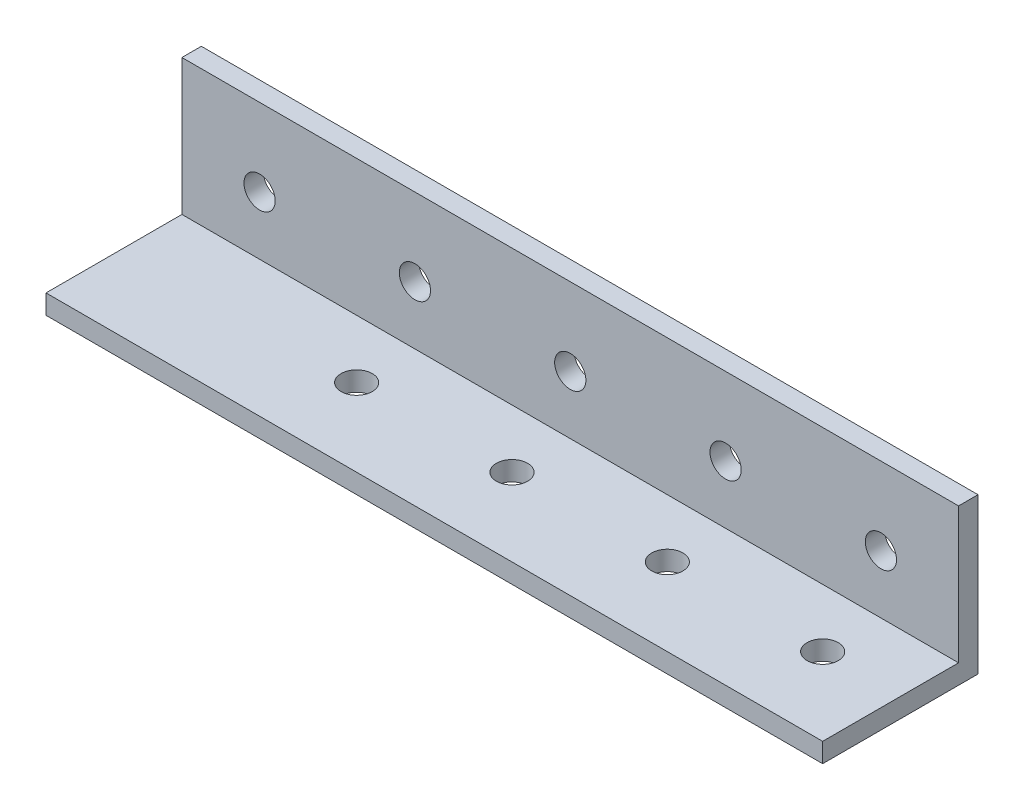
ISO-10303-21;
HEADER;
FILE_DESCRIPTION(('STEP AP214'),'2;1');
FILE_NAME('part.step','',(''),(''),'','','');
FILE_SCHEMA(('AUTOMOTIVE_DESIGN { 1 0 10303 214 1 1 1 1 }'));
ENDSEC;
DATA;
#1=APPLICATION_CONTEXT('core data for automotive mechanical design processes');
#2=APPLICATION_PROTOCOL_DEFINITION('international standard','automotive_design',2000,#1);
#3=PRODUCT_CONTEXT('',#1,'mechanical');
#4=PRODUCT('Part','Part','',(#3));
#5=PRODUCT_RELATED_PRODUCT_CATEGORY('part','',(#4));
#6=PRODUCT_DEFINITION_FORMATION('','',#4);
#7=PRODUCT_DEFINITION_CONTEXT('part definition',#1,'design');
#8=PRODUCT_DEFINITION('design','',#6,#7);
#9=PRODUCT_DEFINITION_SHAPE('','',#8);
#10=(LENGTH_UNIT() NAMED_UNIT(*) SI_UNIT(.MILLI.,.METRE.));
#11=(NAMED_UNIT(*) PLANE_ANGLE_UNIT() SI_UNIT($,.RADIAN.));
#12=(NAMED_UNIT(*) SI_UNIT($,.STERADIAN.) SOLID_ANGLE_UNIT());
#13=UNCERTAINTY_MEASURE_WITH_UNIT(LENGTH_MEASURE(1.E-05),#10,'distance_accuracy_value','');
#14=(GEOMETRIC_REPRESENTATION_CONTEXT(3) GLOBAL_UNCERTAINTY_ASSIGNED_CONTEXT((#13)) GLOBAL_UNIT_ASSIGNED_CONTEXT((#10,
#11,#12)) REPRESENTATION_CONTEXT('',''));
#15=CARTESIAN_POINT('',(0.,0.,0.));
#16=DIRECTION('',(0.,0.,1.));
#17=DIRECTION('',(1.,0.,0.));
#18=AXIS2_PLACEMENT_3D('',#15,#16,#17);
#19=CARTESIAN_POINT('',(127.,0.,0.));
#20=DIRECTION('',(0.,0.,-1.));
#21=DIRECTION('',(-1.,0.,0.));
#22=AXIS2_PLACEMENT_3D('',#19,#20,#21);
#23=PLANE('',#22);
#24=CARTESIAN_POINT('',(12.7,12.7,0.));
#25=DIRECTION('',(0.,0.,1.));
#26=DIRECTION('',(1.,0.,0.));
#27=AXIS2_PLACEMENT_3D('',#24,#25,#26);
#28=CIRCLE('',#27,2.55269999999999);
#29=CARTESIAN_POINT('',(15.2527,12.7,0.));
#30=VERTEX_POINT('',#29);
#31=EDGE_CURVE('E197',#30,#30,#28,.T.);
#32=ORIENTED_EDGE('',*,*,#31,.T.);
#33=EDGE_LOOP('',(#32));
#34=FACE_BOUND('',#33,.T.);
#35=CARTESIAN_POINT('',(38.1,12.7,0.));
#36=DIRECTION('',(0.,0.,1.));
#37=DIRECTION('',(1.,0.,0.));
#38=AXIS2_PLACEMENT_3D('',#35,#36,#37);
#39=CIRCLE('',#38,2.55269999999998);
#40=CARTESIAN_POINT('',(40.6527,12.7,0.));
#41=VERTEX_POINT('',#40);
#42=EDGE_CURVE('E201',#41,#41,#39,.T.);
#43=ORIENTED_EDGE('',*,*,#42,.T.);
#44=EDGE_LOOP('',(#43));
#45=FACE_BOUND('',#44,.T.);
#46=CARTESIAN_POINT('',(63.5,12.7,0.));
#47=DIRECTION('',(0.,0.,1.));
#48=DIRECTION('',(1.,0.,0.));
#49=AXIS2_PLACEMENT_3D('',#46,#47,#48);
#50=CIRCLE('',#49,2.55269999999999);
#51=CARTESIAN_POINT('',(66.0527,12.7,0.));
#52=VERTEX_POINT('',#51);
#53=EDGE_CURVE('E205',#52,#52,#50,.T.);
#54=ORIENTED_EDGE('',*,*,#53,.T.);
#55=EDGE_LOOP('',(#54));
#56=FACE_BOUND('',#55,.T.);
#57=CARTESIAN_POINT('',(88.9,12.7,0.));
#58=DIRECTION('',(0.,0.,1.));
#59=DIRECTION('',(1.,0.,0.));
#60=AXIS2_PLACEMENT_3D('',#57,#58,#59);
#61=CIRCLE('',#60,2.55269999999999);
#62=CARTESIAN_POINT('',(91.4527,12.7,0.));
#63=VERTEX_POINT('',#62);
#64=EDGE_CURVE('E209',#63,#63,#61,.T.);
#65=ORIENTED_EDGE('',*,*,#64,.T.);
#66=EDGE_LOOP('',(#65));
#67=FACE_BOUND('',#66,.T.);
#68=CARTESIAN_POINT('',(114.3,12.7,0.));
#69=DIRECTION('',(0.,0.,1.));
#70=DIRECTION('',(1.,0.,0.));
#71=AXIS2_PLACEMENT_3D('',#68,#69,#70);
#72=CIRCLE('',#71,2.55269999999999);
#73=CARTESIAN_POINT('',(116.8527,12.7,0.));
#74=VERTEX_POINT('',#73);
#75=EDGE_CURVE('E212',#74,#74,#72,.T.);
#76=ORIENTED_EDGE('',*,*,#75,.T.);
#77=EDGE_LOOP('',(#76));
#78=FACE_BOUND('',#77,.T.);
#79=DIRECTION('',(-1.,0.,0.));
#80=VECTOR('',#79,1.);
#81=CARTESIAN_POINT('',(127.,25.4,0.));
#82=LINE('',#81,#80);
#83=CARTESIAN_POINT('',(127.,25.4,0.));
#84=VERTEX_POINT('',#83);
#85=CARTESIAN_POINT('',(0.,25.4,0.));
#86=VERTEX_POINT('',#85);
#87=EDGE_CURVE('E141',#84,#86,#82,.T.);
#88=ORIENTED_EDGE('',*,*,#87,.F.);
#89=DIRECTION('',(0.,1.,0.));
#90=VECTOR('',#89,1.);
#91=CARTESIAN_POINT('',(127.,0.,0.));
#92=LINE('',#91,#90);
#93=CARTESIAN_POINT('',(127.,0.,0.));
#94=VERTEX_POINT('',#93);
#95=EDGE_CURVE('E11',#94,#84,#92,.T.);
#96=ORIENTED_EDGE('',*,*,#95,.F.);
#97=DIRECTION('',(-1.,0.,0.));
#98=VECTOR('',#97,1.);
#99=CARTESIAN_POINT('',(127.,0.,0.));
#100=LINE('',#99,#98);
#101=CARTESIAN_POINT('',(0.,0.,0.));
#102=VERTEX_POINT('',#101);
#103=EDGE_CURVE('E144',#94,#102,#100,.T.);
#104=ORIENTED_EDGE('',*,*,#103,.T.);
#105=DIRECTION('',(0.,1.,0.));
#106=VECTOR('',#105,1.);
#107=CARTESIAN_POINT('',(0.,0.,0.));
#108=LINE('',#107,#106);
#109=EDGE_CURVE('E91',#102,#86,#108,.T.);
#110=ORIENTED_EDGE('',*,*,#109,.T.);
#111=EDGE_LOOP('',(#88,#96,#104,#110));
#112=FACE_BOUND('',#111,.T.);
#113=ADVANCED_FACE('F45',(#34,#45,#56,#67,#78,#112),#23,.T.);
#114=CARTESIAN_POINT('',(127.,0.,25.4));
#115=DIRECTION('',(1.,0.,0.));
#116=DIRECTION('',(0.,0.,-1.));
#117=AXIS2_PLACEMENT_3D('',#114,#115,#116);
#118=PLANE('',#117);
#119=DIRECTION('',(0.,0.,-1.));
#120=VECTOR('',#119,1.);
#121=CARTESIAN_POINT('',(127.,3.175,25.4));
#122=LINE('',#121,#120);
#123=CARTESIAN_POINT('',(127.,3.175,25.4));
#124=VERTEX_POINT('',#123);
#125=CARTESIAN_POINT('',(127.,3.175,3.175));
#126=VERTEX_POINT('',#125);
#127=EDGE_CURVE('E115',#124,#126,#122,.T.);
#128=ORIENTED_EDGE('',*,*,#127,.F.);
#129=DIRECTION('',(0.,1.,0.));
#130=VECTOR('',#129,1.);
#131=CARTESIAN_POINT('',(127.,0.,25.4));
#132=LINE('',#131,#130);
#133=CARTESIAN_POINT('',(127.,0.,25.4));
#134=VERTEX_POINT('',#133);
#135=EDGE_CURVE('E54',#134,#124,#132,.T.);
#136=ORIENTED_EDGE('',*,*,#135,.F.);
#137=DIRECTION('',(0.,0.,-1.));
#138=VECTOR('',#137,1.);
#139=CARTESIAN_POINT('',(127.,0.,25.4));
#140=LINE('',#139,#138);
#141=EDGE_CURVE('E154',#134,#94,#140,.T.);
#142=ORIENTED_EDGE('',*,*,#141,.T.);
#143=ORIENTED_EDGE('',*,*,#95,.T.);
#144=DIRECTION('',(0.,0.,-1.));
#145=VECTOR('',#144,1.);
#146=CARTESIAN_POINT('',(127.,25.4,25.4));
#147=LINE('',#146,#145);
#148=CARTESIAN_POINT('',(127.,25.4,3.175));
#149=VERTEX_POINT('',#148);
#150=EDGE_CURVE('E85',#149,#84,#147,.T.);
#151=ORIENTED_EDGE('',*,*,#150,.F.);
#152=DIRECTION('',(0.,1.,0.));
#153=VECTOR('',#152,1.);
#154=CARTESIAN_POINT('',(127.,3.175,3.175));
#155=LINE('',#154,#153);
#156=EDGE_CURVE('E62',#126,#149,#155,.T.);
#157=ORIENTED_EDGE('',*,*,#156,.F.);
#158=EDGE_LOOP('',(#128,#136,#142,#143,#151,#157));
#159=FACE_BOUND('',#158,.T.);
#160=ADVANCED_FACE('F185',(#159),#118,.T.);
#161=CARTESIAN_POINT('',(0.,0.,25.4));
#162=DIRECTION('',(0.,0.,1.));
#163=DIRECTION('',(1.,0.,0.));
#164=AXIS2_PLACEMENT_3D('',#161,#162,#163);
#165=PLANE('',#164);
#166=DIRECTION('',(1.,0.,0.));
#167=VECTOR('',#166,1.);
#168=CARTESIAN_POINT('',(0.,3.175,25.4));
#169=LINE('',#168,#167);
#170=CARTESIAN_POINT('',(0.,3.175,25.4));
#171=VERTEX_POINT('',#170);
#172=EDGE_CURVE('E138',#171,#124,#169,.T.);
#173=ORIENTED_EDGE('',*,*,#172,.F.);
#174=DIRECTION('',(0.,1.,0.));
#175=VECTOR('',#174,1.);
#176=CARTESIAN_POINT('',(0.,0.,25.4));
#177=LINE('',#176,#175);
#178=CARTESIAN_POINT('',(0.,0.,25.4));
#179=VERTEX_POINT('',#178);
#180=EDGE_CURVE('E127',#179,#171,#177,.T.);
#181=ORIENTED_EDGE('',*,*,#180,.F.);
#182=DIRECTION('',(1.,0.,0.));
#183=VECTOR('',#182,1.);
#184=CARTESIAN_POINT('',(0.,0.,25.4));
#185=LINE('',#184,#183);
#186=EDGE_CURVE('E150',#179,#134,#185,.T.);
#187=ORIENTED_EDGE('',*,*,#186,.T.);
#188=ORIENTED_EDGE('',*,*,#135,.T.);
#189=EDGE_LOOP('',(#173,#181,#187,#188));
#190=FACE_BOUND('',#189,.T.);
#191=ADVANCED_FACE('F192',(#190),#165,.T.);
#192=CARTESIAN_POINT('',(0.,0.,0.));
#193=DIRECTION('',(-1.,0.,0.));
#194=DIRECTION('',(0.,0.,1.));
#195=AXIS2_PLACEMENT_3D('',#192,#193,#194);
#196=PLANE('',#195);
#197=DIRECTION('',(0.,0.,-1.));
#198=VECTOR('',#197,1.);
#199=CARTESIAN_POINT('',(0.,3.175,25.4));
#200=LINE('',#199,#198);
#201=CARTESIAN_POINT('',(0.,3.175,3.175));
#202=VERTEX_POINT('',#201);
#203=EDGE_CURVE('E112',#171,#202,#200,.T.);
#204=ORIENTED_EDGE('',*,*,#203,.T.);
#205=DIRECTION('',(0.,1.,0.));
#206=VECTOR('',#205,1.);
#207=CARTESIAN_POINT('',(0.,3.175,3.175));
#208=LINE('',#207,#206);
#209=CARTESIAN_POINT('',(0.,25.4,3.175));
#210=VERTEX_POINT('',#209);
#211=EDGE_CURVE('E118',#202,#210,#208,.T.);
#212=ORIENTED_EDGE('',*,*,#211,.T.);
#213=DIRECTION('',(0.,0.,1.));
#214=VECTOR('',#213,1.);
#215=CARTESIAN_POINT('',(0.,25.4,0.));
#216=LINE('',#215,#214);
#217=EDGE_CURVE('E160',#86,#210,#216,.T.);
#218=ORIENTED_EDGE('',*,*,#217,.F.);
#219=ORIENTED_EDGE('',*,*,#109,.F.);
#220=DIRECTION('',(0.,0.,1.));
#221=VECTOR('',#220,1.);
#222=CARTESIAN_POINT('',(0.,0.,0.));
#223=LINE('',#222,#221);
#224=EDGE_CURVE('E147',#102,#179,#223,.T.);
#225=ORIENTED_EDGE('',*,*,#224,.T.);
#226=ORIENTED_EDGE('',*,*,#180,.T.);
#227=EDGE_LOOP('',(#204,#212,#218,#219,#225,#226));
#228=FACE_BOUND('',#227,.T.);
#229=ADVANCED_FACE('F126',(#228),#196,.T.);
#230=CARTESIAN_POINT('',(0.,0.,0.));
#231=DIRECTION('',(0.,1.,0.));
#232=DIRECTION('',(0.,0.,1.));
#233=AXIS2_PLACEMENT_3D('',#230,#231,#232);
#234=PLANE('',#233);
#235=CARTESIAN_POINT('',(38.1,0.,12.7));
#236=DIRECTION('',(0.,-1.,0.));
#237=DIRECTION('',(0.,0.,-1.));
#238=AXIS2_PLACEMENT_3D('',#235,#236,#237);
#239=CIRCLE('',#238,2.55269999999998);
#240=CARTESIAN_POINT('',(38.1,0.,10.1473));
#241=VERTEX_POINT('',#240);
#242=EDGE_CURVE('E215',#241,#241,#239,.T.);
#243=ORIENTED_EDGE('',*,*,#242,.F.);
#244=EDGE_LOOP('',(#243));
#245=FACE_BOUND('',#244,.T.);
#246=CARTESIAN_POINT('',(63.5,0.,12.7));
#247=DIRECTION('',(0.,-1.,0.));
#248=DIRECTION('',(0.,0.,-1.));
#249=AXIS2_PLACEMENT_3D('',#246,#247,#248);
#250=CIRCLE('',#249,2.55269999999999);
#251=CARTESIAN_POINT('',(63.5,0.,10.1473));
#252=VERTEX_POINT('',#251);
#253=EDGE_CURVE('E226',#252,#252,#250,.T.);
#254=ORIENTED_EDGE('',*,*,#253,.F.);
#255=EDGE_LOOP('',(#254));
#256=FACE_BOUND('',#255,.T.);
#257=CARTESIAN_POINT('',(88.9,0.,12.7));
#258=DIRECTION('',(0.,-1.,0.));
#259=DIRECTION('',(0.,0.,-1.));
#260=AXIS2_PLACEMENT_3D('',#257,#258,#259);
#261=CIRCLE('',#260,2.55269999999999);
#262=CARTESIAN_POINT('',(88.9,0.,10.1473));
#263=VERTEX_POINT('',#262);
#264=EDGE_CURVE('E234',#263,#263,#261,.T.);
#265=ORIENTED_EDGE('',*,*,#264,.F.);
#266=EDGE_LOOP('',(#265));
#267=FACE_BOUND('',#266,.T.);
#268=CARTESIAN_POINT('',(114.3,0.,12.7));
#269=DIRECTION('',(0.,-1.,0.));
#270=DIRECTION('',(0.,0.,-1.));
#271=AXIS2_PLACEMENT_3D('',#268,#269,#270);
#272=CIRCLE('',#271,2.55269999999999);
#273=CARTESIAN_POINT('',(114.3,0.,10.1473));
#274=VERTEX_POINT('',#273);
#275=EDGE_CURVE('E241',#274,#274,#272,.T.);
#276=ORIENTED_EDGE('',*,*,#275,.F.);
#277=EDGE_LOOP('',(#276));
#278=FACE_BOUND('',#277,.T.);
#279=ORIENTED_EDGE('',*,*,#103,.F.);
#280=ORIENTED_EDGE('',*,*,#141,.F.);
#281=ORIENTED_EDGE('',*,*,#186,.F.);
#282=ORIENTED_EDGE('',*,*,#224,.F.);
#283=EDGE_LOOP('',(#279,#280,#281,#282));
#284=FACE_BOUND('',#283,.T.);
#285=ADVANCED_FACE('F172',(#245,#256,#267,#278,#284),#234,.F.);
#286=CARTESIAN_POINT('',(0.,25.4,0.));
#287=DIRECTION('',(0.,1.,0.));
#288=DIRECTION('',(0.,0.,1.));
#289=AXIS2_PLACEMENT_3D('',#286,#287,#288);
#290=PLANE('',#289);
#291=DIRECTION('',(1.,0.,0.));
#292=VECTOR('',#291,1.);
#293=CARTESIAN_POINT('',(0.,25.4,3.175));
#294=LINE('',#293,#292);
#295=EDGE_CURVE('E117',#210,#149,#294,.T.);
#296=ORIENTED_EDGE('',*,*,#295,.T.);
#297=ORIENTED_EDGE('',*,*,#150,.T.);
#298=ORIENTED_EDGE('',*,*,#87,.T.);
#299=ORIENTED_EDGE('',*,*,#217,.T.);
#300=EDGE_LOOP('',(#296,#297,#298,#299));
#301=FACE_BOUND('',#300,.T.);
#302=ADVANCED_FACE('F170',(#301),#290,.T.);
#303=CARTESIAN_POINT('',(0.,3.175,25.4));
#304=DIRECTION('',(0.,-1.,0.));
#305=DIRECTION('',(0.,0.,-1.));
#306=AXIS2_PLACEMENT_3D('',#303,#304,#305);
#307=PLANE('',#306);
#308=CARTESIAN_POINT('',(38.1,3.175,12.7));
#309=DIRECTION('',(0.,-1.,0.));
#310=DIRECTION('',(0.,0.,-1.));
#311=AXIS2_PLACEMENT_3D('',#308,#309,#310);
#312=CIRCLE('',#311,2.55269999999998);
#313=CARTESIAN_POINT('',(38.1,3.175,10.1473));
#314=VERTEX_POINT('',#313);
#315=EDGE_CURVE('E48',#314,#314,#312,.T.);
#316=ORIENTED_EDGE('',*,*,#315,.T.);
#317=EDGE_LOOP('',(#316));
#318=FACE_BOUND('',#317,.T.);
#319=CARTESIAN_POINT('',(63.5,3.175,12.7));
#320=DIRECTION('',(0.,-1.,0.));
#321=DIRECTION('',(0.,0.,-1.));
#322=AXIS2_PLACEMENT_3D('',#319,#320,#321);
#323=CIRCLE('',#322,2.55269999999999);
#324=CARTESIAN_POINT('',(63.5,3.175,10.1473));
#325=VERTEX_POINT('',#324);
#326=EDGE_CURVE('E230',#325,#325,#323,.T.);
#327=ORIENTED_EDGE('',*,*,#326,.T.);
#328=EDGE_LOOP('',(#327));
#329=FACE_BOUND('',#328,.T.);
#330=CARTESIAN_POINT('',(88.9,3.175,12.7));
#331=DIRECTION('',(0.,-1.,0.));
#332=DIRECTION('',(0.,0.,-1.));
#333=AXIS2_PLACEMENT_3D('',#330,#331,#332);
#334=CIRCLE('',#333,2.55269999999999);
#335=CARTESIAN_POINT('',(88.9,3.175,10.1473));
#336=VERTEX_POINT('',#335);
#337=EDGE_CURVE('E238',#336,#336,#334,.T.);
#338=ORIENTED_EDGE('',*,*,#337,.T.);
#339=EDGE_LOOP('',(#338));
#340=FACE_BOUND('',#339,.T.);
#341=CARTESIAN_POINT('',(114.3,3.175,12.7));
#342=DIRECTION('',(0.,-1.,0.));
#343=DIRECTION('',(0.,0.,-1.));
#344=AXIS2_PLACEMENT_3D('',#341,#342,#343);
#345=CIRCLE('',#344,2.55269999999999);
#346=CARTESIAN_POINT('',(114.3,3.175,10.1473));
#347=VERTEX_POINT('',#346);
#348=EDGE_CURVE('E133',#347,#347,#345,.T.);
#349=ORIENTED_EDGE('',*,*,#348,.T.);
#350=EDGE_LOOP('',(#349));
#351=FACE_BOUND('',#350,.T.);
#352=ORIENTED_EDGE('',*,*,#127,.T.);
#353=DIRECTION('',(1.,0.,0.));
#354=VECTOR('',#353,1.);
#355=CARTESIAN_POINT('',(0.,3.175,3.175));
#356=LINE('',#355,#354);
#357=EDGE_CURVE('E108',#202,#126,#356,.T.);
#358=ORIENTED_EDGE('',*,*,#357,.F.);
#359=ORIENTED_EDGE('',*,*,#203,.F.);
#360=ORIENTED_EDGE('',*,*,#172,.T.);
#361=EDGE_LOOP('',(#352,#358,#359,#360));
#362=FACE_BOUND('',#361,.T.);
#363=ADVANCED_FACE('F110',(#318,#329,#340,#351,#362),#307,.F.);
#364=CARTESIAN_POINT('',(0.,3.175,3.175));
#365=DIRECTION('',(0.,0.,-1.));
#366=DIRECTION('',(-1.,0.,0.));
#367=AXIS2_PLACEMENT_3D('',#364,#365,#366);
#368=PLANE('',#367);
#369=CARTESIAN_POINT('',(12.7,12.7,3.175));
#370=DIRECTION('',(0.,0.,1.));
#371=DIRECTION('',(1.,0.,0.));
#372=AXIS2_PLACEMENT_3D('',#369,#370,#371);
#373=CIRCLE('',#372,2.55269999999999);
#374=CARTESIAN_POINT('',(15.2527,12.7,3.175));
#375=VERTEX_POINT('',#374);
#376=EDGE_CURVE('E293',#375,#375,#373,.T.);
#377=ORIENTED_EDGE('',*,*,#376,.F.);
#378=EDGE_LOOP('',(#377));
#379=FACE_BOUND('',#378,.T.);
#380=CARTESIAN_POINT('',(38.1,12.7,3.175));
#381=DIRECTION('',(0.,0.,1.));
#382=DIRECTION('',(1.,0.,0.));
#383=AXIS2_PLACEMENT_3D('',#380,#381,#382);
#384=CIRCLE('',#383,2.55269999999998);
#385=CARTESIAN_POINT('',(40.6527,12.7,3.175));
#386=VERTEX_POINT('',#385);
#387=EDGE_CURVE('E297',#386,#386,#384,.T.);
#388=ORIENTED_EDGE('',*,*,#387,.F.);
#389=EDGE_LOOP('',(#388));
#390=FACE_BOUND('',#389,.T.);
#391=CARTESIAN_POINT('',(63.5,12.7,3.175));
#392=DIRECTION('',(0.,0.,1.));
#393=DIRECTION('',(1.,0.,0.));
#394=AXIS2_PLACEMENT_3D('',#391,#392,#393);
#395=CIRCLE('',#394,2.55269999999999);
#396=CARTESIAN_POINT('',(66.0527,12.7,3.175));
#397=VERTEX_POINT('',#396);
#398=EDGE_CURVE('E305',#397,#397,#395,.T.);
#399=ORIENTED_EDGE('',*,*,#398,.F.);
#400=EDGE_LOOP('',(#399));
#401=FACE_BOUND('',#400,.T.);
#402=CARTESIAN_POINT('',(88.9,12.7,3.175));
#403=DIRECTION('',(0.,0.,1.));
#404=DIRECTION('',(1.,0.,0.));
#405=AXIS2_PLACEMENT_3D('',#402,#403,#404);
#406=CIRCLE('',#405,2.55269999999999);
#407=CARTESIAN_POINT('',(91.4527,12.7,3.175));
#408=VERTEX_POINT('',#407);
#409=EDGE_CURVE('E311',#408,#408,#406,.T.);
#410=ORIENTED_EDGE('',*,*,#409,.F.);
#411=EDGE_LOOP('',(#410));
#412=FACE_BOUND('',#411,.T.);
#413=CARTESIAN_POINT('',(114.3,12.7,3.175));
#414=DIRECTION('',(0.,0.,1.));
#415=DIRECTION('',(1.,0.,0.));
#416=AXIS2_PLACEMENT_3D('',#413,#414,#415);
#417=CIRCLE('',#416,2.55269999999999);
#418=CARTESIAN_POINT('',(116.8527,12.7,3.175));
#419=VERTEX_POINT('',#418);
#420=EDGE_CURVE('E216',#419,#419,#417,.T.);
#421=ORIENTED_EDGE('',*,*,#420,.F.);
#422=EDGE_LOOP('',(#421));
#423=FACE_BOUND('',#422,.T.);
#424=ORIENTED_EDGE('',*,*,#156,.T.);
#425=ORIENTED_EDGE('',*,*,#295,.F.);
#426=ORIENTED_EDGE('',*,*,#211,.F.);
#427=ORIENTED_EDGE('',*,*,#357,.T.);
#428=EDGE_LOOP('',(#424,#425,#426,#427));
#429=FACE_BOUND('',#428,.T.);
#430=ADVANCED_FACE('F121',(#379,#390,#401,#412,#423,#429),#368,.F.);
#431=CARTESIAN_POINT('',(114.3,0.,12.7));
#432=DIRECTION('',(0.,-1.,0.));
#433=DIRECTION('',(0.,0.,-1.));
#434=AXIS2_PLACEMENT_3D('',#431,#432,#433);
#435=CYLINDRICAL_SURFACE('',#434,2.55269999999999);
#436=ORIENTED_EDGE('',*,*,#275,.T.);
#437=EDGE_LOOP('',(#436));
#438=FACE_BOUND('',#437,.T.);
#439=ORIENTED_EDGE('',*,*,#348,.F.);
#440=EDGE_LOOP('',(#439));
#441=FACE_BOUND('',#440,.T.);
#442=ADVANCED_FACE('F251',(#438,#441),#435,.F.);
#443=CARTESIAN_POINT('',(88.9,0.,12.7));
#444=DIRECTION('',(0.,-1.,0.));
#445=DIRECTION('',(0.,0.,-1.));
#446=AXIS2_PLACEMENT_3D('',#443,#444,#445);
#447=CYLINDRICAL_SURFACE('',#446,2.55269999999999);
#448=ORIENTED_EDGE('',*,*,#264,.T.);
#449=EDGE_LOOP('',(#448));
#450=FACE_BOUND('',#449,.T.);
#451=ORIENTED_EDGE('',*,*,#337,.F.);
#452=EDGE_LOOP('',(#451));
#453=FACE_BOUND('',#452,.T.);
#454=ADVANCED_FACE('F253',(#450,#453),#447,.F.);
#455=CARTESIAN_POINT('',(63.5,0.,12.7));
#456=DIRECTION('',(0.,-1.,0.));
#457=DIRECTION('',(0.,0.,-1.));
#458=AXIS2_PLACEMENT_3D('',#455,#456,#457);
#459=CYLINDRICAL_SURFACE('',#458,2.55269999999999);
#460=ORIENTED_EDGE('',*,*,#253,.T.);
#461=EDGE_LOOP('',(#460));
#462=FACE_BOUND('',#461,.T.);
#463=ORIENTED_EDGE('',*,*,#326,.F.);
#464=EDGE_LOOP('',(#463));
#465=FACE_BOUND('',#464,.T.);
#466=ADVANCED_FACE('F258',(#462,#465),#459,.F.);
#467=CARTESIAN_POINT('',(38.1,0.,12.7));
#468=DIRECTION('',(0.,-1.,0.));
#469=DIRECTION('',(0.,0.,-1.));
#470=AXIS2_PLACEMENT_3D('',#467,#468,#469);
#471=CYLINDRICAL_SURFACE('',#470,2.55269999999998);
#472=ORIENTED_EDGE('',*,*,#242,.T.);
#473=EDGE_LOOP('',(#472));
#474=FACE_BOUND('',#473,.T.);
#475=ORIENTED_EDGE('',*,*,#315,.F.);
#476=EDGE_LOOP('',(#475));
#477=FACE_BOUND('',#476,.T.);
#478=ADVANCED_FACE('F266',(#474,#477),#471,.F.);
#479=CARTESIAN_POINT('',(114.3,12.7,3.175));
#480=DIRECTION('',(0.,0.,1.));
#481=DIRECTION('',(1.,0.,0.));
#482=AXIS2_PLACEMENT_3D('',#479,#480,#481);
#483=CYLINDRICAL_SURFACE('',#482,2.55269999999999);
#484=ORIENTED_EDGE('',*,*,#75,.F.);
#485=EDGE_LOOP('',(#484));
#486=FACE_BOUND('',#485,.T.);
#487=ORIENTED_EDGE('',*,*,#420,.T.);
#488=EDGE_LOOP('',(#487));
#489=FACE_BOUND('',#488,.T.);
#490=ADVANCED_FACE('F269',(#486,#489),#483,.F.);
#491=CARTESIAN_POINT('',(88.9,12.7,3.175));
#492=DIRECTION('',(0.,0.,1.));
#493=DIRECTION('',(1.,0.,0.));
#494=AXIS2_PLACEMENT_3D('',#491,#492,#493);
#495=CYLINDRICAL_SURFACE('',#494,2.55269999999999);
#496=ORIENTED_EDGE('',*,*,#64,.F.);
#497=EDGE_LOOP('',(#496));
#498=FACE_BOUND('',#497,.T.);
#499=ORIENTED_EDGE('',*,*,#409,.T.);
#500=EDGE_LOOP('',(#499));
#501=FACE_BOUND('',#500,.T.);
#502=ADVANCED_FACE('F273',(#498,#501),#495,.F.);
#503=CARTESIAN_POINT('',(63.5,12.7,3.175));
#504=DIRECTION('',(0.,0.,1.));
#505=DIRECTION('',(1.,0.,0.));
#506=AXIS2_PLACEMENT_3D('',#503,#504,#505);
#507=CYLINDRICAL_SURFACE('',#506,2.55269999999999);
#508=ORIENTED_EDGE('',*,*,#53,.F.);
#509=EDGE_LOOP('',(#508));
#510=FACE_BOUND('',#509,.T.);
#511=ORIENTED_EDGE('',*,*,#398,.T.);
#512=EDGE_LOOP('',(#511));
#513=FACE_BOUND('',#512,.T.);
#514=ADVANCED_FACE('F276',(#510,#513),#507,.F.);
#515=CARTESIAN_POINT('',(38.1,12.7,3.175));
#516=DIRECTION('',(0.,0.,1.));
#517=DIRECTION('',(1.,0.,0.));
#518=AXIS2_PLACEMENT_3D('',#515,#516,#517);
#519=CYLINDRICAL_SURFACE('',#518,2.55269999999998);
#520=ORIENTED_EDGE('',*,*,#42,.F.);
#521=EDGE_LOOP('',(#520));
#522=FACE_BOUND('',#521,.T.);
#523=ORIENTED_EDGE('',*,*,#387,.T.);
#524=EDGE_LOOP('',(#523));
#525=FACE_BOUND('',#524,.T.);
#526=ADVANCED_FACE('F280',(#522,#525),#519,.F.);
#527=CARTESIAN_POINT('',(12.7,12.7,3.175));
#528=DIRECTION('',(0.,0.,1.));
#529=DIRECTION('',(1.,0.,0.));
#530=AXIS2_PLACEMENT_3D('',#527,#528,#529);
#531=CYLINDRICAL_SURFACE('',#530,2.55269999999999);
#532=ORIENTED_EDGE('',*,*,#31,.F.);
#533=EDGE_LOOP('',(#532));
#534=FACE_BOUND('',#533,.T.);
#535=ORIENTED_EDGE('',*,*,#376,.T.);
#536=EDGE_LOOP('',(#535));
#537=FACE_BOUND('',#536,.T.);
#538=ADVANCED_FACE('F284',(#534,#537),#531,.F.);
#539=CLOSED_SHELL('',(#113,#160,#191,#229,#285,#302,#363,#430,#442,#454,#466,#478,#490,#502,
#514,#526,#538));
#540=MANIFOLD_SOLID_BREP('B2',#539);
#541=ADVANCED_BREP_SHAPE_REPRESENTATION('',(#18,#540),#14);
#542=SHAPE_DEFINITION_REPRESENTATION(#9,#541);
ENDSEC;
END-ISO-10303-21;
